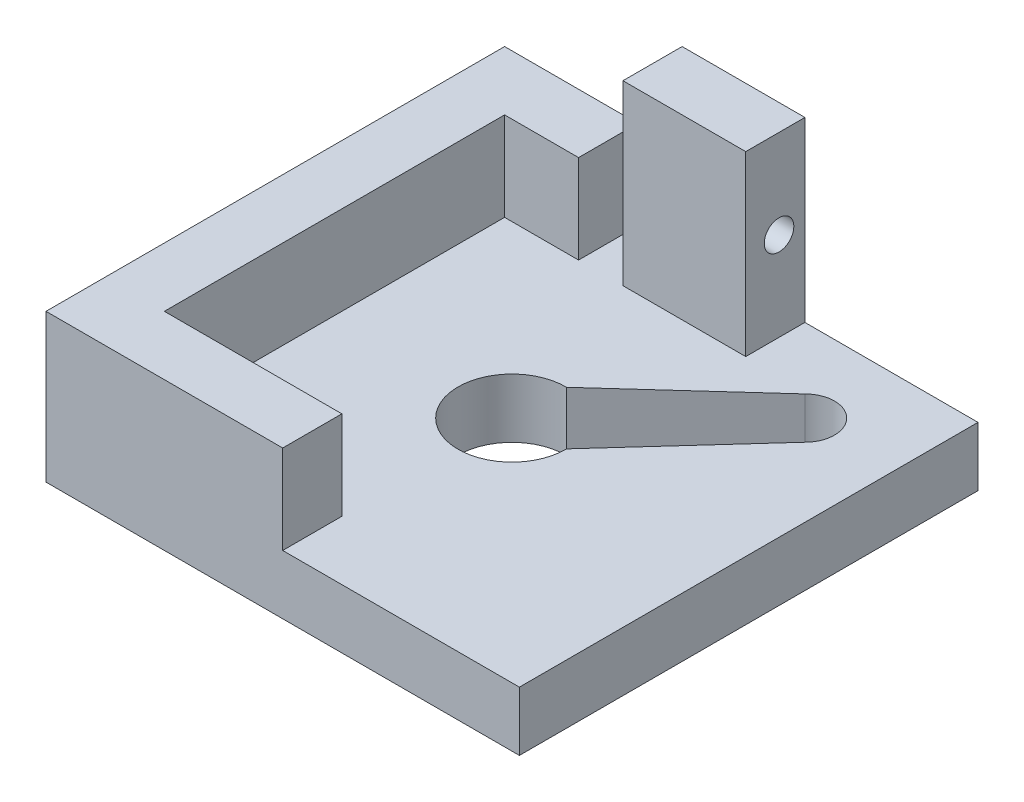
ISO-10303-21;
HEADER;
FILE_DESCRIPTION(('STEP AP214'),'2;1');
FILE_NAME('part.step','',(''),(''),'','','');
FILE_SCHEMA(('AUTOMOTIVE_DESIGN { 1 0 10303 214 1 1 1 1 }'));
ENDSEC;
DATA;
#1=APPLICATION_CONTEXT('core data for automotive mechanical design processes');
#2=APPLICATION_PROTOCOL_DEFINITION('international standard','automotive_design',2000,#1);
#3=PRODUCT_CONTEXT('',#1,'mechanical');
#4=PRODUCT('Part','Part','',(#3));
#5=PRODUCT_RELATED_PRODUCT_CATEGORY('part','',(#4));
#6=PRODUCT_DEFINITION_FORMATION('','',#4);
#7=PRODUCT_DEFINITION_CONTEXT('part definition',#1,'design');
#8=PRODUCT_DEFINITION('design','',#6,#7);
#9=PRODUCT_DEFINITION_SHAPE('','',#8);
#10=(LENGTH_UNIT() NAMED_UNIT(*) SI_UNIT(.MILLI.,.METRE.));
#11=(NAMED_UNIT(*) PLANE_ANGLE_UNIT() SI_UNIT($,.RADIAN.));
#12=(NAMED_UNIT(*) SI_UNIT($,.STERADIAN.) SOLID_ANGLE_UNIT());
#13=UNCERTAINTY_MEASURE_WITH_UNIT(LENGTH_MEASURE(1.E-05),#10,'distance_accuracy_value','');
#14=(GEOMETRIC_REPRESENTATION_CONTEXT(3) GLOBAL_UNCERTAINTY_ASSIGNED_CONTEXT((#13)) GLOBAL_UNIT_ASSIGNED_CONTEXT((#10,
#11,#12)) REPRESENTATION_CONTEXT('',''));
#15=CARTESIAN_POINT('',(0.,0.,0.));
#16=DIRECTION('',(0.,0.,1.));
#17=DIRECTION('',(1.,0.,0.));
#18=AXIS2_PLACEMENT_3D('',#15,#16,#17);
#19=CARTESIAN_POINT('',(0.,4.,0.));
#20=DIRECTION('',(0.,-1.,0.));
#21=DIRECTION('',(0.,0.,-1.));
#22=AXIS2_PLACEMENT_3D('',#19,#20,#21);
#23=PLANE('',#22);
#24=DIRECTION('',(0.,0.,1.));
#25=VECTOR('',#24,1.);
#26=CARTESIAN_POINT('',(-4.,4.,-11.5));
#27=LINE('',#26,#25);
#28=CARTESIAN_POINT('',(-4.,4.,-15.5));
#29=VERTEX_POINT('',#28);
#30=CARTESIAN_POINT('',(-4.,4.,-11.5));
#31=VERTEX_POINT('',#30);
#32=EDGE_CURVE('E199',#29,#31,#27,.T.);
#33=ORIENTED_EDGE('',*,*,#32,.F.);
#34=DIRECTION('',(-1.,0.,0.));
#35=VECTOR('',#34,1.);
#36=CARTESIAN_POINT('',(-16.,4.,-15.5));
#37=LINE('',#36,#35);
#38=CARTESIAN_POINT('',(-7.,4.,-15.5));
#39=VERTEX_POINT('',#38);
#40=EDGE_CURVE('E286',#29,#39,#37,.T.);
#41=ORIENTED_EDGE('',*,*,#40,.T.);
#42=DIRECTION('',(0.,0.,-1.));
#43=VECTOR('',#42,1.);
#44=CARTESIAN_POINT('',(-7.,4.,-15.5));
#45=LINE('',#44,#43);
#46=CARTESIAN_POINT('',(-7.,4.,-11.5));
#47=VERTEX_POINT('',#46);
#48=EDGE_CURVE('E236',#47,#39,#45,.T.);
#49=ORIENTED_EDGE('',*,*,#48,.F.);
#50=DIRECTION('',(1.,0.,0.));
#51=VECTOR('',#50,1.);
#52=CARTESIAN_POINT('',(-7.,4.,-11.5));
#53=LINE('',#52,#51);
#54=CARTESIAN_POINT('',(-12.,4.,-11.5));
#55=VERTEX_POINT('',#54);
#56=EDGE_CURVE('E260',#55,#47,#53,.T.);
#57=ORIENTED_EDGE('',*,*,#56,.F.);
#58=DIRECTION('',(0.,0.,-1.));
#59=VECTOR('',#58,1.);
#60=CARTESIAN_POINT('',(-12.,4.,-11.5));
#61=LINE('',#60,#59);
#62=CARTESIAN_POINT('',(-12.,4.,11.5));
#63=VERTEX_POINT('',#62);
#64=EDGE_CURVE('E257',#63,#55,#61,.T.);
#65=ORIENTED_EDGE('',*,*,#64,.F.);
#66=DIRECTION('',(-1.,0.,0.));
#67=VECTOR('',#66,1.);
#68=CARTESIAN_POINT('',(-12.,4.,11.5));
#69=LINE('',#68,#67);
#70=CARTESIAN_POINT('',(0.,4.,11.5));
#71=VERTEX_POINT('',#70);
#72=EDGE_CURVE('E254',#71,#63,#69,.T.);
#73=ORIENTED_EDGE('',*,*,#72,.F.);
#74=DIRECTION('',(0.,0.,-1.));
#75=VECTOR('',#74,1.);
#76=CARTESIAN_POINT('',(0.,4.,15.5));
#77=LINE('',#76,#75);
#78=CARTESIAN_POINT('',(0.,4.,15.5));
#79=VERTEX_POINT('',#78);
#80=EDGE_CURVE('E231',#79,#71,#77,.T.);
#81=ORIENTED_EDGE('',*,*,#80,.F.);
#82=DIRECTION('',(1.,0.,0.));
#83=VECTOR('',#82,1.);
#84=CARTESIAN_POINT('',(-16.,4.,15.5));
#85=LINE('',#84,#83);
#86=CARTESIAN_POINT('',(16.,4.,15.5));
#87=VERTEX_POINT('',#86);
#88=EDGE_CURVE('E290',#79,#87,#85,.T.);
#89=ORIENTED_EDGE('',*,*,#88,.T.);
#90=DIRECTION('',(0.,0.,-1.));
#91=VECTOR('',#90,1.);
#92=CARTESIAN_POINT('',(16.,4.,15.5));
#93=LINE('',#92,#91);
#94=CARTESIAN_POINT('',(16.,4.,-15.5));
#95=VERTEX_POINT('',#94);
#96=EDGE_CURVE('E283',#87,#95,#93,.T.);
#97=ORIENTED_EDGE('',*,*,#96,.T.);
#98=CARTESIAN_POINT('',(4.3,4.,-15.5));
#99=VERTEX_POINT('',#98);
#100=EDGE_CURVE('E288',#95,#99,#37,.T.);
#101=ORIENTED_EDGE('',*,*,#100,.T.);
#102=DIRECTION('',(0.,0.,-1.));
#103=VECTOR('',#102,1.);
#104=CARTESIAN_POINT('',(4.3,4.,-11.5));
#105=LINE('',#104,#103);
#106=CARTESIAN_POINT('',(4.3,4.,-11.5));
#107=VERTEX_POINT('',#106);
#108=EDGE_CURVE('E206',#107,#99,#105,.T.);
#109=ORIENTED_EDGE('',*,*,#108,.F.);
#110=DIRECTION('',(1.,0.,0.));
#111=VECTOR('',#110,1.);
#112=CARTESIAN_POINT('',(-4.,4.,-11.5));
#113=LINE('',#112,#111);
#114=EDGE_CURVE('E215',#31,#107,#113,.T.);
#115=ORIENTED_EDGE('',*,*,#114,.F.);
#116=EDGE_LOOP('',(#33,#41,#49,#57,#65,#73,#81,#89,#97,#101,#109,#115));
#117=FACE_BOUND('',#116,.T.);
#118=CARTESIAN_POINT('',(9.89949493661086,4.,-9.89949493661249));
#119=DIRECTION('',(0.,1.,0.));
#120=DIRECTION('',(0.,0.,1.));
#121=AXIS2_PLACEMENT_3D('',#118,#119,#120);
#122=CIRCLE('',#121,1.99999999999998);
#123=CARTESIAN_POINT('',(8.48528137423761,4.,-11.3137084989855));
#124=VERTEX_POINT('',#123);
#125=CARTESIAN_POINT('',(11.3137084989841,4.,-8.48528137423954));
#126=VERTEX_POINT('',#125);
#127=EDGE_CURVE('E50',#124,#126,#122,.F.);
#128=ORIENTED_EDGE('',*,*,#127,.T.);
#129=DIRECTION('',(0.672174077301893,0.,-0.740393145432444));
#130=VECTOR('',#129,1.);
#131=CARTESIAN_POINT('',(1.9790753524492,4.,1.79672537104119));
#132=LINE('',#131,#130);
#133=CARTESIAN_POINT('',(3.64974082328763,4.,-0.0434962392365473));
#134=VERTEX_POINT('',#133);
#135=EDGE_CURVE('E177',#134,#126,#132,.T.);
#136=ORIENTED_EDGE('',*,*,#135,.F.);
#137=CARTESIAN_POINT('',(0.,4.,0.));
#138=DIRECTION('',(0.,1.,0.));
#139=DIRECTION('',(0.,0.,1.));
#140=AXIS2_PLACEMENT_3D('',#137,#138,#139);
#141=CIRCLE('',#140,3.65);
#142=CARTESIAN_POINT('',(0.0434962392359386,4.,-3.64974082328764));
#143=VERTEX_POINT('',#142);
#144=EDGE_CURVE('E180',#143,#134,#141,.T.);
#145=ORIENTED_EDGE('',*,*,#144,.F.);
#146=DIRECTION('',(0.740393145432332,0.,-0.672174077302016));
#147=VECTOR('',#146,1.);
#148=CARTESIAN_POINT('',(-1.79672537104152,4.,-1.9790753524489));
#149=LINE('',#148,#147);
#150=EDGE_CURVE('E186',#143,#124,#149,.T.);
#151=ORIENTED_EDGE('',*,*,#150,.T.);
#152=EDGE_LOOP('',(#128,#136,#145,#151));
#153=FACE_BOUND('',#152,.T.);
#154=ADVANCED_FACE('F35',(#117,#153),#23,.F.);
#155=CARTESIAN_POINT('',(0.,0.,0.));
#156=DIRECTION('',(0.,-1.,0.));
#157=DIRECTION('',(0.,0.,-1.));
#158=AXIS2_PLACEMENT_3D('',#155,#156,#157);
#159=PLANE('',#158);
#160=DIRECTION('',(0.,0.,-1.));
#161=VECTOR('',#160,1.);
#162=CARTESIAN_POINT('',(16.,0.,15.5));
#163=LINE('',#162,#161);
#164=CARTESIAN_POINT('',(16.,0.,15.5));
#165=VERTEX_POINT('',#164);
#166=CARTESIAN_POINT('',(16.,0.,-15.5));
#167=VERTEX_POINT('',#166);
#168=EDGE_CURVE('E282',#165,#167,#163,.T.);
#169=ORIENTED_EDGE('',*,*,#168,.F.);
#170=DIRECTION('',(1.,0.,0.));
#171=VECTOR('',#170,1.);
#172=CARTESIAN_POINT('',(-16.,0.,15.5));
#173=LINE('',#172,#171);
#174=CARTESIAN_POINT('',(-16.,0.,15.5));
#175=VERTEX_POINT('',#174);
#176=EDGE_CURVE('E287',#175,#165,#173,.T.);
#177=ORIENTED_EDGE('',*,*,#176,.F.);
#178=DIRECTION('',(0.,0.,1.));
#179=VECTOR('',#178,1.);
#180=CARTESIAN_POINT('',(-16.,0.,15.5));
#181=LINE('',#180,#179);
#182=CARTESIAN_POINT('',(-16.,0.,-15.5));
#183=VERTEX_POINT('',#182);
#184=EDGE_CURVE('E297',#183,#175,#181,.T.);
#185=ORIENTED_EDGE('',*,*,#184,.F.);
#186=DIRECTION('',(-1.,0.,0.));
#187=VECTOR('',#186,1.);
#188=CARTESIAN_POINT('',(-16.,0.,-15.5));
#189=LINE('',#188,#187);
#190=EDGE_CURVE('E295',#167,#183,#189,.T.);
#191=ORIENTED_EDGE('',*,*,#190,.F.);
#192=EDGE_LOOP('',(#169,#177,#185,#191));
#193=FACE_BOUND('',#192,.T.);
#194=DIRECTION('',(0.672174077301893,0.,-0.740393145432444));
#195=VECTOR('',#194,1.);
#196=CARTESIAN_POINT('',(1.9790753524492,0.,1.79672537104119));
#197=LINE('',#196,#195);
#198=CARTESIAN_POINT('',(3.64974082328763,0.,-0.0434962392365473));
#199=VERTEX_POINT('',#198);
#200=CARTESIAN_POINT('',(11.3137084989841,0.,-8.48528137423954));
#201=VERTEX_POINT('',#200);
#202=EDGE_CURVE('E172',#199,#201,#197,.T.);
#203=ORIENTED_EDGE('',*,*,#202,.T.);
#204=CARTESIAN_POINT('',(9.89949493661086,0.,-9.89949493661249));
#205=DIRECTION('',(0.,1.,0.));
#206=DIRECTION('',(0.,0.,1.));
#207=AXIS2_PLACEMENT_3D('',#204,#205,#206);
#208=CIRCLE('',#207,1.99999999999998);
#209=CARTESIAN_POINT('',(8.48528137423761,0.,-11.3137084989855));
#210=VERTEX_POINT('',#209);
#211=EDGE_CURVE('E168',#210,#201,#208,.F.);
#212=ORIENTED_EDGE('',*,*,#211,.F.);
#213=DIRECTION('',(0.740393145432332,0.,-0.672174077302016));
#214=VECTOR('',#213,1.);
#215=CARTESIAN_POINT('',(-1.79672537104152,0.,-1.9790753524489));
#216=LINE('',#215,#214);
#217=CARTESIAN_POINT('',(0.0434962392359389,0.,-3.64974082328764));
#218=VERTEX_POINT('',#217);
#219=EDGE_CURVE('E160',#218,#210,#216,.T.);
#220=ORIENTED_EDGE('',*,*,#219,.F.);
#221=CARTESIAN_POINT('',(0.,0.,0.));
#222=DIRECTION('',(0.,1.,0.));
#223=DIRECTION('',(0.,0.,1.));
#224=AXIS2_PLACEMENT_3D('',#221,#222,#223);
#225=CIRCLE('',#224,3.65);
#226=EDGE_CURVE('E58',#218,#199,#225,.T.);
#227=ORIENTED_EDGE('',*,*,#226,.T.);
#228=EDGE_LOOP('',(#203,#212,#220,#227));
#229=FACE_BOUND('',#228,.T.);
#230=ADVANCED_FACE('F175',(#193,#229),#159,.T.);
#231=CARTESIAN_POINT('',(16.,4.,15.5));
#232=DIRECTION('',(-1.,0.,0.));
#233=DIRECTION('',(0.,0.,1.));
#234=AXIS2_PLACEMENT_3D('',#231,#232,#233);
#235=PLANE('',#234);
#236=ORIENTED_EDGE('',*,*,#168,.T.);
#237=DIRECTION('',(0.,-1.,0.));
#238=VECTOR('',#237,1.);
#239=CARTESIAN_POINT('',(16.,4.,-15.5));
#240=LINE('',#239,#238);
#241=EDGE_CURVE('E11',#95,#167,#240,.T.);
#242=ORIENTED_EDGE('',*,*,#241,.F.);
#243=ORIENTED_EDGE('',*,*,#96,.F.);
#244=DIRECTION('',(0.,-1.,0.));
#245=VECTOR('',#244,1.);
#246=CARTESIAN_POINT('',(16.,4.,15.5));
#247=LINE('',#246,#245);
#248=EDGE_CURVE('E292',#87,#165,#247,.T.);
#249=ORIENTED_EDGE('',*,*,#248,.T.);
#250=EDGE_LOOP('',(#236,#242,#243,#249));
#251=FACE_BOUND('',#250,.T.);
#252=ADVANCED_FACE('F37',(#251),#235,.F.);
#253=CARTESIAN_POINT('',(-16.,4.,-15.5));
#254=DIRECTION('',(0.,0.,1.));
#255=DIRECTION('',(1.,0.,0.));
#256=AXIS2_PLACEMENT_3D('',#253,#254,#255);
#257=PLANE('',#256);
#258=ORIENTED_EDGE('',*,*,#190,.T.);
#259=DIRECTION('',(0.,-1.,0.));
#260=VECTOR('',#259,1.);
#261=CARTESIAN_POINT('',(-16.,4.,-15.5));
#262=LINE('',#261,#260);
#263=CARTESIAN_POINT('',(-16.,10.,-15.5));
#264=VERTEX_POINT('',#263);
#265=EDGE_CURVE('E43',#264,#183,#262,.T.);
#266=ORIENTED_EDGE('',*,*,#265,.F.);
#267=DIRECTION('',(-1.,0.,0.));
#268=VECTOR('',#267,1.);
#269=CARTESIAN_POINT('',(-16.,10.,-15.5));
#270=LINE('',#269,#268);
#271=CARTESIAN_POINT('',(-7.,10.,-15.5));
#272=VERTEX_POINT('',#271);
#273=EDGE_CURVE('E232',#272,#264,#270,.T.);
#274=ORIENTED_EDGE('',*,*,#273,.F.);
#275=DIRECTION('',(0.,-1.,0.));
#276=VECTOR('',#275,1.);
#277=CARTESIAN_POINT('',(-7.,10.,-15.5));
#278=LINE('',#277,#276);
#279=EDGE_CURVE('E251',#272,#39,#278,.T.);
#280=ORIENTED_EDGE('',*,*,#279,.T.);
#281=ORIENTED_EDGE('',*,*,#40,.F.);
#282=DIRECTION('',(0.,-1.,0.));
#283=VECTOR('',#282,1.);
#284=CARTESIAN_POINT('',(-4.,16.,-15.5));
#285=LINE('',#284,#283);
#286=CARTESIAN_POINT('',(-4.,16.,-15.5));
#287=VERTEX_POINT('',#286);
#288=EDGE_CURVE('E212',#287,#29,#285,.T.);
#289=ORIENTED_EDGE('',*,*,#288,.F.);
#290=DIRECTION('',(-1.,0.,0.));
#291=VECTOR('',#290,1.);
#292=CARTESIAN_POINT('',(-4.,16.,-15.5));
#293=LINE('',#292,#291);
#294=CARTESIAN_POINT('',(4.3,16.,-15.5));
#295=VERTEX_POINT('',#294);
#296=EDGE_CURVE('E210',#295,#287,#293,.T.);
#297=ORIENTED_EDGE('',*,*,#296,.F.);
#298=DIRECTION('',(0.,-1.,0.));
#299=VECTOR('',#298,1.);
#300=CARTESIAN_POINT('',(4.3,16.,-15.5));
#301=LINE('',#300,#299);
#302=EDGE_CURVE('E222',#295,#99,#301,.T.);
#303=ORIENTED_EDGE('',*,*,#302,.T.);
#304=ORIENTED_EDGE('',*,*,#100,.F.);
#305=ORIENTED_EDGE('',*,*,#241,.T.);
#306=EDGE_LOOP('',(#258,#266,#274,#280,#281,#289,#297,#303,#304,#305));
#307=FACE_BOUND('',#306,.T.);
#308=ADVANCED_FACE('F336',(#307),#257,.F.);
#309=CARTESIAN_POINT('',(-16.,4.,15.5));
#310=DIRECTION('',(1.,0.,0.));
#311=DIRECTION('',(0.,0.,-1.));
#312=AXIS2_PLACEMENT_3D('',#309,#310,#311);
#313=PLANE('',#312);
#314=ORIENTED_EDGE('',*,*,#184,.T.);
#315=DIRECTION('',(0.,-1.,0.));
#316=VECTOR('',#315,1.);
#317=CARTESIAN_POINT('',(-16.,4.,15.5));
#318=LINE('',#317,#316);
#319=CARTESIAN_POINT('',(-16.,10.,15.5));
#320=VERTEX_POINT('',#319);
#321=EDGE_CURVE('E302',#320,#175,#318,.T.);
#322=ORIENTED_EDGE('',*,*,#321,.F.);
#323=DIRECTION('',(0.,0.,1.));
#324=VECTOR('',#323,1.);
#325=CARTESIAN_POINT('',(-16.,10.,-15.5));
#326=LINE('',#325,#324);
#327=EDGE_CURVE('E235',#264,#320,#326,.T.);
#328=ORIENTED_EDGE('',*,*,#327,.F.);
#329=ORIENTED_EDGE('',*,*,#265,.T.);
#330=EDGE_LOOP('',(#314,#322,#328,#329));
#331=FACE_BOUND('',#330,.T.);
#332=ADVANCED_FACE('F308',(#331),#313,.F.);
#333=CARTESIAN_POINT('',(-16.,4.,15.5));
#334=DIRECTION('',(0.,0.,-1.));
#335=DIRECTION('',(-1.,0.,0.));
#336=AXIS2_PLACEMENT_3D('',#333,#334,#335);
#337=PLANE('',#336);
#338=ORIENTED_EDGE('',*,*,#176,.T.);
#339=ORIENTED_EDGE('',*,*,#248,.F.);
#340=ORIENTED_EDGE('',*,*,#88,.F.);
#341=DIRECTION('',(0.,-1.,0.));
#342=VECTOR('',#341,1.);
#343=CARTESIAN_POINT('',(0.,10.,15.5));
#344=LINE('',#343,#342);
#345=CARTESIAN_POINT('',(0.,10.,15.5));
#346=VERTEX_POINT('',#345);
#347=EDGE_CURVE('E279',#346,#79,#344,.T.);
#348=ORIENTED_EDGE('',*,*,#347,.F.);
#349=DIRECTION('',(1.,0.,0.));
#350=VECTOR('',#349,1.);
#351=CARTESIAN_POINT('',(-16.,10.,15.5));
#352=LINE('',#351,#350);
#353=EDGE_CURVE('E239',#320,#346,#352,.T.);
#354=ORIENTED_EDGE('',*,*,#353,.F.);
#355=ORIENTED_EDGE('',*,*,#321,.T.);
#356=EDGE_LOOP('',(#338,#339,#340,#348,#354,#355));
#357=FACE_BOUND('',#356,.T.);
#358=ADVANCED_FACE('F316',(#357),#337,.F.);
#359=CARTESIAN_POINT('',(0.,10.,15.5));
#360=DIRECTION('',(-1.,0.,0.));
#361=DIRECTION('',(0.,0.,1.));
#362=AXIS2_PLACEMENT_3D('',#359,#360,#361);
#363=PLANE('',#362);
#364=ORIENTED_EDGE('',*,*,#80,.T.);
#365=DIRECTION('',(0.,-1.,0.));
#366=VECTOR('',#365,1.);
#367=CARTESIAN_POINT('',(0.,10.,11.5));
#368=LINE('',#367,#366);
#369=CARTESIAN_POINT('',(0.,10.,11.5));
#370=VERTEX_POINT('',#369);
#371=EDGE_CURVE('E276',#370,#71,#368,.T.);
#372=ORIENTED_EDGE('',*,*,#371,.F.);
#373=DIRECTION('',(0.,0.,-1.));
#374=VECTOR('',#373,1.);
#375=CARTESIAN_POINT('',(0.,10.,15.5));
#376=LINE('',#375,#374);
#377=EDGE_CURVE('E241',#346,#370,#376,.T.);
#378=ORIENTED_EDGE('',*,*,#377,.F.);
#379=ORIENTED_EDGE('',*,*,#347,.T.);
#380=EDGE_LOOP('',(#364,#372,#378,#379));
#381=FACE_BOUND('',#380,.T.);
#382=ADVANCED_FACE('F328',(#381),#363,.F.);
#383=CARTESIAN_POINT('',(-12.,10.,11.5));
#384=DIRECTION('',(0.,0.,1.));
#385=DIRECTION('',(1.,0.,0.));
#386=AXIS2_PLACEMENT_3D('',#383,#384,#385);
#387=PLANE('',#386);
#388=ORIENTED_EDGE('',*,*,#72,.T.);
#389=DIRECTION('',(0.,-1.,0.));
#390=VECTOR('',#389,1.);
#391=CARTESIAN_POINT('',(-12.,10.,11.5));
#392=LINE('',#391,#390);
#393=CARTESIAN_POINT('',(-12.,10.,11.5));
#394=VERTEX_POINT('',#393);
#395=EDGE_CURVE('E273',#394,#63,#392,.T.);
#396=ORIENTED_EDGE('',*,*,#395,.F.);
#397=DIRECTION('',(-1.,0.,0.));
#398=VECTOR('',#397,1.);
#399=CARTESIAN_POINT('',(-12.,10.,11.5));
#400=LINE('',#399,#398);
#401=EDGE_CURVE('E243',#370,#394,#400,.T.);
#402=ORIENTED_EDGE('',*,*,#401,.F.);
#403=ORIENTED_EDGE('',*,*,#371,.T.);
#404=EDGE_LOOP('',(#388,#396,#402,#403));
#405=FACE_BOUND('',#404,.T.);
#406=ADVANCED_FACE('F349',(#405),#387,.F.);
#407=CARTESIAN_POINT('',(-12.,10.,-11.5));
#408=DIRECTION('',(-1.,0.,0.));
#409=DIRECTION('',(0.,0.,1.));
#410=AXIS2_PLACEMENT_3D('',#407,#408,#409);
#411=PLANE('',#410);
#412=ORIENTED_EDGE('',*,*,#64,.T.);
#413=DIRECTION('',(0.,-1.,0.));
#414=VECTOR('',#413,1.);
#415=CARTESIAN_POINT('',(-12.,10.,-11.5));
#416=LINE('',#415,#414);
#417=CARTESIAN_POINT('',(-12.,10.,-11.5));
#418=VERTEX_POINT('',#417);
#419=EDGE_CURVE('E270',#418,#55,#416,.T.);
#420=ORIENTED_EDGE('',*,*,#419,.F.);
#421=DIRECTION('',(0.,0.,-1.));
#422=VECTOR('',#421,1.);
#423=CARTESIAN_POINT('',(-12.,10.,-11.5));
#424=LINE('',#423,#422);
#425=EDGE_CURVE('E245',#394,#418,#424,.T.);
#426=ORIENTED_EDGE('',*,*,#425,.F.);
#427=ORIENTED_EDGE('',*,*,#395,.T.);
#428=EDGE_LOOP('',(#412,#420,#426,#427));
#429=FACE_BOUND('',#428,.T.);
#430=ADVANCED_FACE('F347',(#429),#411,.F.);
#431=CARTESIAN_POINT('',(-7.,10.,-11.5));
#432=DIRECTION('',(0.,0.,-1.));
#433=DIRECTION('',(-1.,0.,0.));
#434=AXIS2_PLACEMENT_3D('',#431,#432,#433);
#435=PLANE('',#434);
#436=ORIENTED_EDGE('',*,*,#56,.T.);
#437=DIRECTION('',(0.,-1.,0.));
#438=VECTOR('',#437,1.);
#439=CARTESIAN_POINT('',(-7.,10.,-11.5));
#440=LINE('',#439,#438);
#441=CARTESIAN_POINT('',(-7.,10.,-11.5));
#442=VERTEX_POINT('',#441);
#443=EDGE_CURVE('E267',#442,#47,#440,.T.);
#444=ORIENTED_EDGE('',*,*,#443,.F.);
#445=DIRECTION('',(1.,0.,0.));
#446=VECTOR('',#445,1.);
#447=CARTESIAN_POINT('',(-7.,10.,-11.5));
#448=LINE('',#447,#446);
#449=EDGE_CURVE('E247',#418,#442,#448,.T.);
#450=ORIENTED_EDGE('',*,*,#449,.F.);
#451=ORIENTED_EDGE('',*,*,#419,.T.);
#452=EDGE_LOOP('',(#436,#444,#450,#451));
#453=FACE_BOUND('',#452,.T.);
#454=ADVANCED_FACE('F342',(#453),#435,.F.);
#455=CARTESIAN_POINT('',(-7.,10.,-15.5));
#456=DIRECTION('',(-1.,0.,0.));
#457=DIRECTION('',(0.,0.,1.));
#458=AXIS2_PLACEMENT_3D('',#455,#456,#457);
#459=PLANE('',#458);
#460=ORIENTED_EDGE('',*,*,#48,.T.);
#461=ORIENTED_EDGE('',*,*,#279,.F.);
#462=DIRECTION('',(0.,0.,-1.));
#463=VECTOR('',#462,1.);
#464=CARTESIAN_POINT('',(-7.,10.,-15.5));
#465=LINE('',#464,#463);
#466=EDGE_CURVE('E249',#442,#272,#465,.T.);
#467=ORIENTED_EDGE('',*,*,#466,.F.);
#468=ORIENTED_EDGE('',*,*,#443,.T.);
#469=EDGE_LOOP('',(#460,#461,#467,#468));
#470=FACE_BOUND('',#469,.T.);
#471=ADVANCED_FACE('F339',(#470),#459,.F.);
#472=CARTESIAN_POINT('',(0.,10.,0.));
#473=DIRECTION('',(0.,-1.,0.));
#474=DIRECTION('',(0.,0.,-1.));
#475=AXIS2_PLACEMENT_3D('',#472,#473,#474);
#476=PLANE('',#475);
#477=ORIENTED_EDGE('',*,*,#273,.T.);
#478=ORIENTED_EDGE('',*,*,#327,.T.);
#479=ORIENTED_EDGE('',*,*,#353,.T.);
#480=ORIENTED_EDGE('',*,*,#377,.T.);
#481=ORIENTED_EDGE('',*,*,#401,.T.);
#482=ORIENTED_EDGE('',*,*,#425,.T.);
#483=ORIENTED_EDGE('',*,*,#449,.T.);
#484=ORIENTED_EDGE('',*,*,#466,.T.);
#485=EDGE_LOOP('',(#477,#478,#479,#480,#481,#482,#483,#484));
#486=FACE_BOUND('',#485,.T.);
#487=ADVANCED_FACE('F332',(#486),#476,.F.);
#488=CARTESIAN_POINT('',(-4.,16.,-11.5));
#489=DIRECTION('',(1.,0.,0.));
#490=DIRECTION('',(0.,0.,-1.));
#491=AXIS2_PLACEMENT_3D('',#488,#489,#490);
#492=PLANE('',#491);
#493=ORIENTED_EDGE('',*,*,#32,.T.);
#494=DIRECTION('',(0.,-1.,0.));
#495=VECTOR('',#494,1.);
#496=CARTESIAN_POINT('',(-4.,16.,-11.5));
#497=LINE('',#496,#495);
#498=CARTESIAN_POINT('',(-4.,16.,-11.5));
#499=VERTEX_POINT('',#498);
#500=EDGE_CURVE('E228',#499,#31,#497,.T.);
#501=ORIENTED_EDGE('',*,*,#500,.F.);
#502=DIRECTION('',(0.,0.,1.));
#503=VECTOR('',#502,1.);
#504=CARTESIAN_POINT('',(-4.,16.,-11.5));
#505=LINE('',#504,#503);
#506=EDGE_CURVE('E202',#287,#499,#505,.T.);
#507=ORIENTED_EDGE('',*,*,#506,.F.);
#508=ORIENTED_EDGE('',*,*,#288,.T.);
#509=EDGE_LOOP('',(#493,#501,#507,#508));
#510=FACE_BOUND('',#509,.T.);
#511=ADVANCED_FACE('F444',(#510),#492,.F.);
#512=CARTESIAN_POINT('',(-4.,16.,-11.5));
#513=DIRECTION('',(0.,0.,-1.));
#514=DIRECTION('',(-1.,0.,0.));
#515=AXIS2_PLACEMENT_3D('',#512,#513,#514);
#516=PLANE('',#515);
#517=ORIENTED_EDGE('',*,*,#114,.T.);
#518=DIRECTION('',(0.,-1.,0.));
#519=VECTOR('',#518,1.);
#520=CARTESIAN_POINT('',(4.3,16.,-11.5));
#521=LINE('',#520,#519);
#522=CARTESIAN_POINT('',(4.3,16.,-11.5));
#523=VERTEX_POINT('',#522);
#524=EDGE_CURVE('E225',#523,#107,#521,.T.);
#525=ORIENTED_EDGE('',*,*,#524,.F.);
#526=DIRECTION('',(1.,0.,0.));
#527=VECTOR('',#526,1.);
#528=CARTESIAN_POINT('',(-4.,16.,-11.5));
#529=LINE('',#528,#527);
#530=EDGE_CURVE('E205',#499,#523,#529,.T.);
#531=ORIENTED_EDGE('',*,*,#530,.F.);
#532=ORIENTED_EDGE('',*,*,#500,.T.);
#533=EDGE_LOOP('',(#517,#525,#531,#532));
#534=FACE_BOUND('',#533,.T.);
#535=ADVANCED_FACE('F440',(#534),#516,.F.);
#536=CARTESIAN_POINT('',(4.3,16.,-11.5));
#537=DIRECTION('',(-1.,0.,0.));
#538=DIRECTION('',(0.,0.,1.));
#539=AXIS2_PLACEMENT_3D('',#536,#537,#538);
#540=PLANE('',#539);
#541=CARTESIAN_POINT('',(4.3,10.,-13.75));
#542=DIRECTION('',(1.,0.,0.));
#543=DIRECTION('',(0.,0.,-1.));
#544=AXIS2_PLACEMENT_3D('',#541,#542,#543);
#545=CIRCLE('',#544,1.);
#546=CARTESIAN_POINT('',(4.3,10.,-14.75));
#547=VERTEX_POINT('',#546);
#548=EDGE_CURVE('E192',#547,#547,#545,.T.);
#549=ORIENTED_EDGE('',*,*,#548,.F.);
#550=EDGE_LOOP('',(#549));
#551=FACE_BOUND('',#550,.T.);
#552=ORIENTED_EDGE('',*,*,#108,.T.);
#553=ORIENTED_EDGE('',*,*,#302,.F.);
#554=DIRECTION('',(0.,0.,-1.));
#555=VECTOR('',#554,1.);
#556=CARTESIAN_POINT('',(4.3,16.,-11.5));
#557=LINE('',#556,#555);
#558=EDGE_CURVE('E208',#523,#295,#557,.T.);
#559=ORIENTED_EDGE('',*,*,#558,.F.);
#560=ORIENTED_EDGE('',*,*,#524,.T.);
#561=EDGE_LOOP('',(#552,#553,#559,#560));
#562=FACE_BOUND('',#561,.T.);
#563=ADVANCED_FACE('F436',(#551,#562),#540,.F.);
#564=CARTESIAN_POINT('',(0.,16.,0.));
#565=DIRECTION('',(0.,-1.,0.));
#566=DIRECTION('',(0.,0.,-1.));
#567=AXIS2_PLACEMENT_3D('',#564,#565,#566);
#568=PLANE('',#567);
#569=ORIENTED_EDGE('',*,*,#506,.T.);
#570=ORIENTED_EDGE('',*,*,#530,.T.);
#571=ORIENTED_EDGE('',*,*,#558,.T.);
#572=ORIENTED_EDGE('',*,*,#296,.T.);
#573=EDGE_LOOP('',(#569,#570,#571,#572));
#574=FACE_BOUND('',#573,.T.);
#575=ADVANCED_FACE('F432',(#574),#568,.F.);
#576=CARTESIAN_POINT('',(-0.699999999999999,10.,-13.75));
#577=DIRECTION('',(1.,0.,0.));
#578=DIRECTION('',(0.,0.,-1.));
#579=AXIS2_PLACEMENT_3D('',#576,#577,#578);
#580=CYLINDRICAL_SURFACE('',#579,1.);
#581=CARTESIAN_POINT('',(-0.699999999999999,10.,-13.75));
#582=DIRECTION('',(1.,0.,0.));
#583=DIRECTION('',(0.,0.,-1.));
#584=AXIS2_PLACEMENT_3D('',#581,#582,#583);
#585=CIRCLE('',#584,1.);
#586=CARTESIAN_POINT('',(-0.699999999999999,10.,-14.75));
#587=VERTEX_POINT('',#586);
#588=EDGE_CURVE('E196',#587,#587,#585,.T.);
#589=ORIENTED_EDGE('',*,*,#588,.F.);
#590=EDGE_LOOP('',(#589));
#591=FACE_BOUND('',#590,.T.);
#592=ORIENTED_EDGE('',*,*,#548,.T.);
#593=EDGE_LOOP('',(#592));
#594=FACE_BOUND('',#593,.T.);
#595=ADVANCED_FACE('F428',(#591,#594),#580,.F.);
#596=CARTESIAN_POINT('',(-0.699999999999999,10.,-13.75));
#597=DIRECTION('',(1.,0.,0.));
#598=DIRECTION('',(0.,0.,-1.));
#599=AXIS2_PLACEMENT_3D('',#596,#597,#598);
#600=PLANE('',#599);
#601=ORIENTED_EDGE('',*,*,#588,.T.);
#602=EDGE_LOOP('',(#601));
#603=FACE_BOUND('',#602,.T.);
#604=ADVANCED_FACE('F393',(#603),#600,.T.);
#605=CARTESIAN_POINT('',(9.89949493661086,0.,-9.89949493661249));
#606=DIRECTION('',(0.,1.,0.));
#607=DIRECTION('',(0.,0.,1.));
#608=AXIS2_PLACEMENT_3D('',#605,#606,#607);
#609=CYLINDRICAL_SURFACE('',#608,1.99999999999998);
#610=ORIENTED_EDGE('',*,*,#127,.F.);
#611=DIRECTION('',(0.,1.,0.));
#612=VECTOR('',#611,1.);
#613=CARTESIAN_POINT('',(8.48528137423761,0.,-11.3137084989855));
#614=LINE('',#613,#612);
#615=EDGE_CURVE('E163',#210,#124,#614,.T.);
#616=ORIENTED_EDGE('',*,*,#615,.F.);
#617=ORIENTED_EDGE('',*,*,#211,.T.);
#618=DIRECTION('',(0.,1.,0.));
#619=VECTOR('',#618,1.);
#620=CARTESIAN_POINT('',(11.3137084989841,0.,-8.48528137423954));
#621=LINE('',#620,#619);
#622=EDGE_CURVE('E190',#201,#126,#621,.T.);
#623=ORIENTED_EDGE('',*,*,#622,.T.);
#624=EDGE_LOOP('',(#610,#616,#617,#623));
#625=FACE_BOUND('',#624,.T.);
#626=ADVANCED_FACE('F170',(#625),#609,.F.);
#627=CARTESIAN_POINT('',(1.9790753524492,0.,1.79672537104119));
#628=DIRECTION('',(0.740393145432444,0.,0.672174077301893));
#629=DIRECTION('',(0.672174077301893,0.,-0.740393145432444));
#630=AXIS2_PLACEMENT_3D('',#627,#628,#629);
#631=PLANE('',#630);
#632=ORIENTED_EDGE('',*,*,#135,.T.);
#633=ORIENTED_EDGE('',*,*,#622,.F.);
#634=ORIENTED_EDGE('',*,*,#202,.F.);
#635=DIRECTION('',(0.,1.,0.));
#636=VECTOR('',#635,1.);
#637=CARTESIAN_POINT('',(3.64974082328763,0.,-0.0434962392365473));
#638=LINE('',#637,#636);
#639=EDGE_CURVE('E193',#199,#134,#638,.T.);
#640=ORIENTED_EDGE('',*,*,#639,.T.);
#641=EDGE_LOOP('',(#632,#633,#634,#640));
#642=FACE_BOUND('',#641,.T.);
#643=ADVANCED_FACE('F392',(#642),#631,.F.);
#644=CARTESIAN_POINT('',(0.,0.,0.));
#645=DIRECTION('',(0.,1.,0.));
#646=DIRECTION('',(0.,0.,1.));
#647=AXIS2_PLACEMENT_3D('',#644,#645,#646);
#648=CYLINDRICAL_SURFACE('',#647,3.65);
#649=ORIENTED_EDGE('',*,*,#144,.T.);
#650=ORIENTED_EDGE('',*,*,#639,.F.);
#651=ORIENTED_EDGE('',*,*,#226,.F.);
#652=DIRECTION('',(0.,1.,0.));
#653=VECTOR('',#652,1.);
#654=CARTESIAN_POINT('',(0.0434962392359386,0.,-3.64974082328764));
#655=LINE('',#654,#653);
#656=EDGE_CURVE('E165',#218,#143,#655,.T.);
#657=ORIENTED_EDGE('',*,*,#656,.T.);
#658=EDGE_LOOP('',(#649,#650,#651,#657));
#659=FACE_BOUND('',#658,.T.);
#660=ADVANCED_FACE('F404',(#659),#648,.F.);
#661=CARTESIAN_POINT('',(-1.79672537104152,0.,-1.9790753524489));
#662=DIRECTION('',(0.672174077302017,0.,0.740393145432332));
#663=DIRECTION('',(0.740393145432332,0.,-0.672174077302017));
#664=AXIS2_PLACEMENT_3D('',#661,#662,#663);
#665=PLANE('',#664);
#666=ORIENTED_EDGE('',*,*,#150,.F.);
#667=ORIENTED_EDGE('',*,*,#656,.F.);
#668=ORIENTED_EDGE('',*,*,#219,.T.);
#669=ORIENTED_EDGE('',*,*,#615,.T.);
#670=EDGE_LOOP('',(#666,#667,#668,#669));
#671=FACE_BOUND('',#670,.T.);
#672=ADVANCED_FACE('F162',(#671),#665,.T.);
#673=CLOSED_SHELL('',(#154,#230,#252,#308,#332,#358,#382,#406,#430,#454,#471,#487,#511,#535,
#563,#575,#595,#604,#626,#643,#660,#672));
#674=MANIFOLD_SOLID_BREP('B2',#673);
#675=ADVANCED_BREP_SHAPE_REPRESENTATION('',(#18,#674),#14);
#676=SHAPE_DEFINITION_REPRESENTATION(#9,#675);
ENDSEC;
END-ISO-10303-21;
